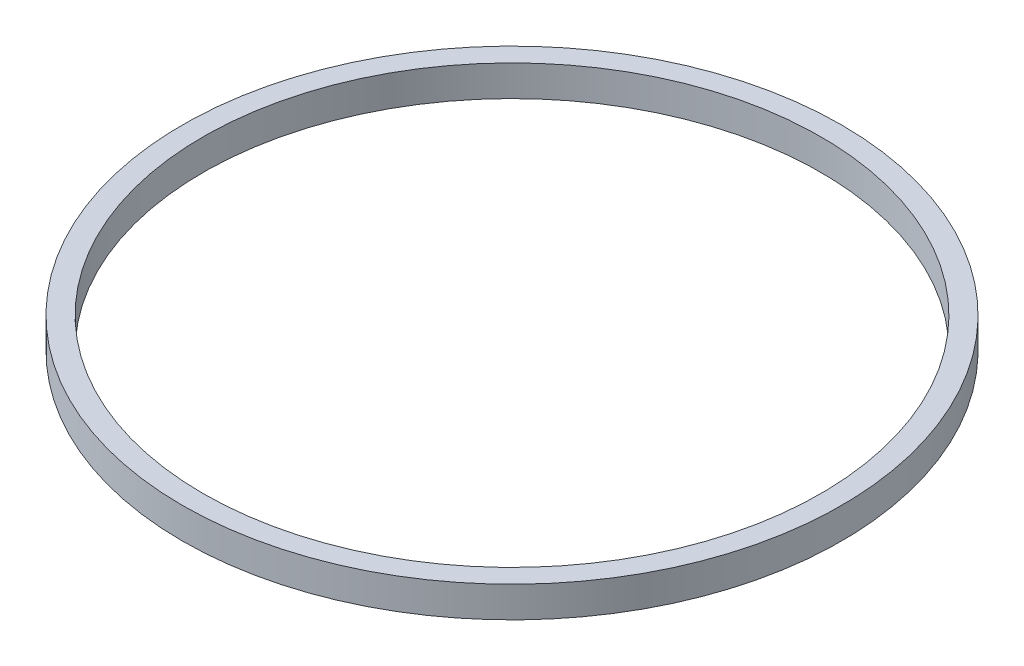
ISO-10303-21;
HEADER;
FILE_DESCRIPTION(('STEP AP214'),'2;1');
FILE_NAME('part.step','',(''),(''),'','','');
FILE_SCHEMA(('AUTOMOTIVE_DESIGN { 1 0 10303 214 1 1 1 1 }'));
ENDSEC;
DATA;
#1=APPLICATION_CONTEXT('core data for automotive mechanical design processes');
#2=APPLICATION_PROTOCOL_DEFINITION('international standard','automotive_design',2000,#1);
#3=PRODUCT_CONTEXT('',#1,'mechanical');
#4=PRODUCT('Part','Part','',(#3));
#5=PRODUCT_RELATED_PRODUCT_CATEGORY('part','',(#4));
#6=PRODUCT_DEFINITION_FORMATION('','',#4);
#7=PRODUCT_DEFINITION_CONTEXT('part definition',#1,'design');
#8=PRODUCT_DEFINITION('design','',#6,#7);
#9=PRODUCT_DEFINITION_SHAPE('','',#8);
#10=(LENGTH_UNIT() NAMED_UNIT(*) SI_UNIT(.MILLI.,.METRE.));
#11=(NAMED_UNIT(*) PLANE_ANGLE_UNIT() SI_UNIT($,.RADIAN.));
#12=(NAMED_UNIT(*) SI_UNIT($,.STERADIAN.) SOLID_ANGLE_UNIT());
#13=UNCERTAINTY_MEASURE_WITH_UNIT(LENGTH_MEASURE(1.E-05),#10,'distance_accuracy_value','');
#14=(GEOMETRIC_REPRESENTATION_CONTEXT(3) GLOBAL_UNCERTAINTY_ASSIGNED_CONTEXT((#13)) GLOBAL_UNIT_ASSIGNED_CONTEXT((#10,
#11,#12)) REPRESENTATION_CONTEXT('',''));
#15=CARTESIAN_POINT('',(0.,0.,0.));
#16=DIRECTION('',(0.,0.,1.));
#17=DIRECTION('',(1.,0.,0.));
#18=AXIS2_PLACEMENT_3D('',#15,#16,#17);
#19=CARTESIAN_POINT('',(0.,3.,0.));
#20=DIRECTION('',(0.,1.,0.));
#21=DIRECTION('',(0.,0.,1.));
#22=AXIS2_PLACEMENT_3D('',#19,#20,#21);
#23=PLANE('',#22);
#24=CARTESIAN_POINT('',(0.,3.,0.));
#25=DIRECTION('',(0.,1.,0.));
#26=DIRECTION('',(0.,0.,1.));
#27=AXIS2_PLACEMENT_3D('',#24,#25,#26);
#28=CIRCLE('',#27,32.);
#29=CARTESIAN_POINT('',(0.,3.,32.));
#30=VERTEX_POINT('',#29);
#31=EDGE_CURVE('E10',#30,#30,#28,.T.);
#32=ORIENTED_EDGE('',*,*,#31,.T.);
#33=EDGE_LOOP('',(#32));
#34=FACE_BOUND('',#33,.T.);
#35=CARTESIAN_POINT('',(0.,3.,0.));
#36=DIRECTION('',(0.,1.,0.));
#37=DIRECTION('',(0.,0.,1.));
#38=AXIS2_PLACEMENT_3D('',#35,#36,#37);
#39=CIRCLE('',#38,30.);
#40=CARTESIAN_POINT('',(0.,3.,30.));
#41=VERTEX_POINT('',#40);
#42=EDGE_CURVE('E46',#41,#41,#39,.T.);
#43=ORIENTED_EDGE('',*,*,#42,.F.);
#44=EDGE_LOOP('',(#43));
#45=FACE_BOUND('',#44,.T.);
#46=ADVANCED_FACE('F35',(#34,#45),#23,.T.);
#47=CARTESIAN_POINT('',(0.,0.,0.));
#48=DIRECTION('',(0.,1.,0.));
#49=DIRECTION('',(0.,0.,1.));
#50=AXIS2_PLACEMENT_3D('',#47,#48,#49);
#51=PLANE('',#50);
#52=CARTESIAN_POINT('',(0.,0.,0.));
#53=DIRECTION('',(0.,1.,0.));
#54=DIRECTION('',(0.,0.,1.));
#55=AXIS2_PLACEMENT_3D('',#52,#53,#54);
#56=CIRCLE('',#55,32.);
#57=CARTESIAN_POINT('',(0.,0.,32.));
#58=VERTEX_POINT('',#57);
#59=EDGE_CURVE('E39',#58,#58,#56,.T.);
#60=ORIENTED_EDGE('',*,*,#59,.F.);
#61=EDGE_LOOP('',(#60));
#62=FACE_BOUND('',#61,.T.);
#63=CARTESIAN_POINT('',(0.,0.,0.));
#64=DIRECTION('',(0.,1.,0.));
#65=DIRECTION('',(0.,0.,1.));
#66=AXIS2_PLACEMENT_3D('',#63,#64,#65);
#67=CIRCLE('',#66,30.);
#68=CARTESIAN_POINT('',(0.,0.,30.));
#69=VERTEX_POINT('',#68);
#70=EDGE_CURVE('E48',#69,#69,#67,.T.);
#71=ORIENTED_EDGE('',*,*,#70,.T.);
#72=EDGE_LOOP('',(#71));
#73=FACE_BOUND('',#72,.T.);
#74=ADVANCED_FACE('F58',(#62,#73),#51,.F.);
#75=CARTESIAN_POINT('',(0.,3.,0.));
#76=DIRECTION('',(0.,-1.,0.));
#77=DIRECTION('',(0.,0.,-1.));
#78=AXIS2_PLACEMENT_3D('',#75,#76,#77);
#79=CYLINDRICAL_SURFACE('',#78,32.);
#80=ORIENTED_EDGE('',*,*,#31,.F.);
#81=EDGE_LOOP('',(#80));
#82=FACE_BOUND('',#81,.T.);
#83=ORIENTED_EDGE('',*,*,#59,.T.);
#84=EDGE_LOOP('',(#83));
#85=FACE_BOUND('',#84,.T.);
#86=ADVANCED_FACE('F37',(#82,#85),#79,.T.);
#87=CARTESIAN_POINT('',(0.,3.,0.));
#88=DIRECTION('',(0.,-1.,0.));
#89=DIRECTION('',(0.,0.,-1.));
#90=AXIS2_PLACEMENT_3D('',#87,#88,#89);
#91=CYLINDRICAL_SURFACE('',#90,30.);
#92=ORIENTED_EDGE('',*,*,#42,.T.);
#93=EDGE_LOOP('',(#92));
#94=FACE_BOUND('',#93,.T.);
#95=ORIENTED_EDGE('',*,*,#70,.F.);
#96=EDGE_LOOP('',(#95));
#97=FACE_BOUND('',#96,.T.);
#98=ADVANCED_FACE('F54',(#94,#97),#91,.F.);
#99=CLOSED_SHELL('',(#46,#74,#86,#98));
#100=MANIFOLD_SOLID_BREP('B2',#99);
#101=ADVANCED_BREP_SHAPE_REPRESENTATION('',(#18,#100),#14);
#102=SHAPE_DEFINITION_REPRESENTATION(#9,#101);
ENDSEC;
END-ISO-10303-21;
